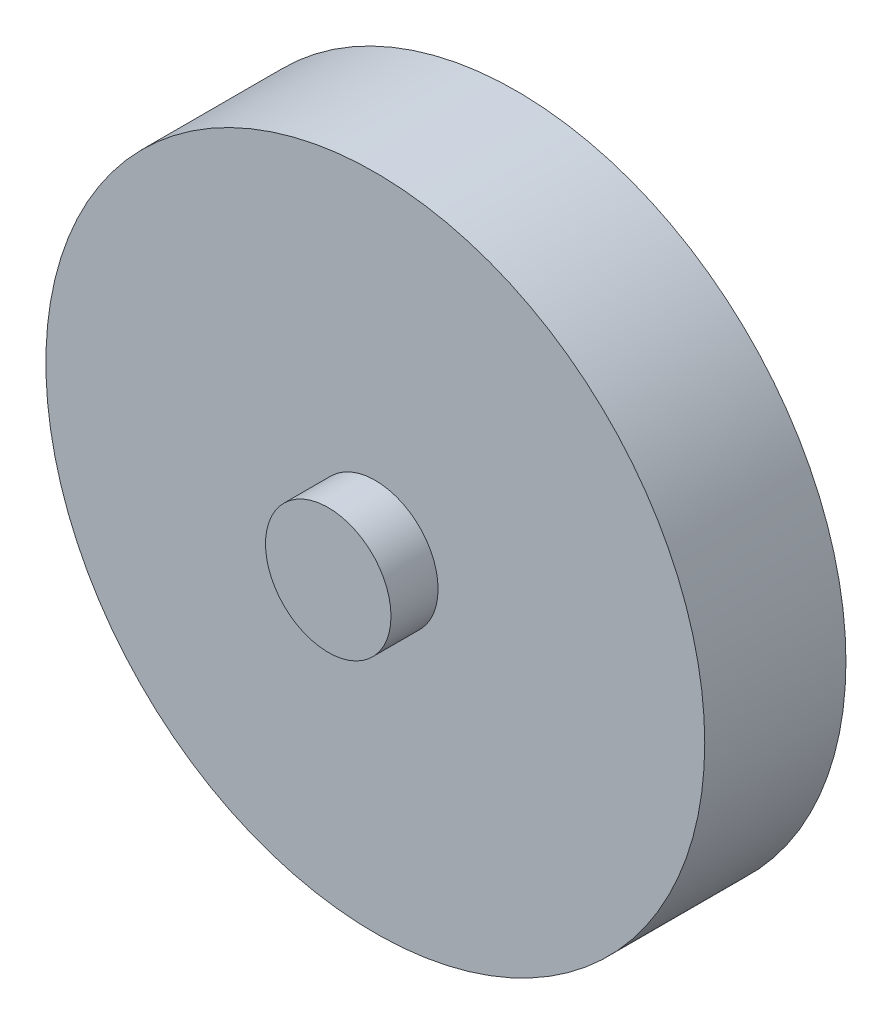
ISO-10303-21;
HEADER;
FILE_DESCRIPTION(('STEP AP214'),'2;1');
FILE_NAME('part.step','',(''),(''),'','','');
FILE_SCHEMA(('AUTOMOTIVE_DESIGN { 1 0 10303 214 1 1 1 1 }'));
ENDSEC;
DATA;
#1=APPLICATION_CONTEXT('core data for automotive mechanical design processes');
#2=APPLICATION_PROTOCOL_DEFINITION('international standard','automotive_design',2000,#1);
#3=PRODUCT_CONTEXT('',#1,'mechanical');
#4=PRODUCT('Part','Part','',(#3));
#5=PRODUCT_RELATED_PRODUCT_CATEGORY('part','',(#4));
#6=PRODUCT_DEFINITION_FORMATION('','',#4);
#7=PRODUCT_DEFINITION_CONTEXT('part definition',#1,'design');
#8=PRODUCT_DEFINITION('design','',#6,#7);
#9=PRODUCT_DEFINITION_SHAPE('','',#8);
#10=(LENGTH_UNIT() NAMED_UNIT(*) SI_UNIT(.MILLI.,.METRE.));
#11=(NAMED_UNIT(*) PLANE_ANGLE_UNIT() SI_UNIT($,.RADIAN.));
#12=(NAMED_UNIT(*) SI_UNIT($,.STERADIAN.) SOLID_ANGLE_UNIT());
#13=UNCERTAINTY_MEASURE_WITH_UNIT(LENGTH_MEASURE(1.E-05),#10,'distance_accuracy_value','');
#14=(GEOMETRIC_REPRESENTATION_CONTEXT(3) GLOBAL_UNCERTAINTY_ASSIGNED_CONTEXT((#13)) GLOBAL_UNIT_ASSIGNED_CONTEXT((#10,
#11,#12)) REPRESENTATION_CONTEXT('',''));
#15=CARTESIAN_POINT('',(0.,0.,0.));
#16=DIRECTION('',(0.,0.,1.));
#17=DIRECTION('',(1.,0.,0.));
#18=AXIS2_PLACEMENT_3D('',#15,#16,#17);
#19=CARTESIAN_POINT('',(0.,0.,24.));
#20=DIRECTION('',(0.,0.,-1.));
#21=DIRECTION('',(-1.,0.,0.));
#22=AXIS2_PLACEMENT_3D('',#19,#20,#21);
#23=CYLINDRICAL_SURFACE('',#22,8.);
#24=CARTESIAN_POINT('',(0.,0.,18.));
#25=DIRECTION('',(0.,0.,1.));
#26=DIRECTION('',(1.,0.,0.));
#27=AXIS2_PLACEMENT_3D('',#24,#25,#26);
#28=CIRCLE('',#27,8.);
#29=CARTESIAN_POINT('',(8.,0.,18.));
#30=VERTEX_POINT('',#29);
#31=EDGE_CURVE('E42',#30,#30,#28,.T.);
#32=ORIENTED_EDGE('',*,*,#31,.T.);
#33=EDGE_LOOP('',(#32));
#34=FACE_BOUND('',#33,.T.);
#35=CARTESIAN_POINT('',(0.,0.,24.));
#36=DIRECTION('',(0.,0.,1.));
#37=DIRECTION('',(1.,0.,0.));
#38=AXIS2_PLACEMENT_3D('',#35,#36,#37);
#39=CIRCLE('',#38,8.);
#40=CARTESIAN_POINT('',(8.,0.,24.));
#41=VERTEX_POINT('',#40);
#42=EDGE_CURVE('E10',#41,#41,#39,.T.);
#43=ORIENTED_EDGE('',*,*,#42,.F.);
#44=EDGE_LOOP('',(#43));
#45=FACE_BOUND('',#44,.T.);
#46=ADVANCED_FACE('F39',(#34,#45),#23,.T.);
#47=CARTESIAN_POINT('',(0.,0.,24.));
#48=DIRECTION('',(0.,0.,1.));
#49=DIRECTION('',(1.,0.,0.));
#50=AXIS2_PLACEMENT_3D('',#47,#48,#49);
#51=PLANE('',#50);
#52=ORIENTED_EDGE('',*,*,#42,.T.);
#53=EDGE_LOOP('',(#52));
#54=FACE_BOUND('',#53,.T.);
#55=ADVANCED_FACE('F62',(#54),#51,.T.);
#56=CARTESIAN_POINT('',(0.,0.,18.));
#57=DIRECTION('',(0.,0.,-1.));
#58=DIRECTION('',(-1.,0.,0.));
#59=AXIS2_PLACEMENT_3D('',#56,#57,#58);
#60=CYLINDRICAL_SURFACE('',#59,42.);
#61=CARTESIAN_POINT('',(0.,0.,18.));
#62=DIRECTION('',(0.,0.,1.));
#63=DIRECTION('',(1.,0.,0.));
#64=AXIS2_PLACEMENT_3D('',#61,#62,#63);
#65=CIRCLE('',#64,42.);
#66=CARTESIAN_POINT('',(42.,0.,18.));
#67=VERTEX_POINT('',#66);
#68=EDGE_CURVE('E49',#67,#67,#65,.T.);
#69=ORIENTED_EDGE('',*,*,#68,.F.);
#70=EDGE_LOOP('',(#69));
#71=FACE_BOUND('',#70,.T.);
#72=CARTESIAN_POINT('',(0.,0.,0.));
#73=DIRECTION('',(0.,0.,1.));
#74=DIRECTION('',(1.,0.,0.));
#75=AXIS2_PLACEMENT_3D('',#72,#73,#74);
#76=CIRCLE('',#75,42.);
#77=CARTESIAN_POINT('',(42.,0.,0.));
#78=VERTEX_POINT('',#77);
#79=EDGE_CURVE('E51',#78,#78,#76,.T.);
#80=ORIENTED_EDGE('',*,*,#79,.T.);
#81=EDGE_LOOP('',(#80));
#82=FACE_BOUND('',#81,.T.);
#83=ADVANCED_FACE('F59',(#71,#82),#60,.T.);
#84=CARTESIAN_POINT('',(0.,0.,18.));
#85=DIRECTION('',(0.,0.,1.));
#86=DIRECTION('',(1.,0.,0.));
#87=AXIS2_PLACEMENT_3D('',#84,#85,#86);
#88=PLANE('',#87);
#89=ORIENTED_EDGE('',*,*,#31,.F.);
#90=EDGE_LOOP('',(#89));
#91=FACE_BOUND('',#90,.T.);
#92=ORIENTED_EDGE('',*,*,#68,.T.);
#93=EDGE_LOOP('',(#92));
#94=FACE_BOUND('',#93,.T.);
#95=ADVANCED_FACE('F57',(#91,#94),#88,.T.);
#96=CARTESIAN_POINT('',(0.,0.,0.));
#97=DIRECTION('',(0.,0.,1.));
#98=DIRECTION('',(1.,0.,0.));
#99=AXIS2_PLACEMENT_3D('',#96,#97,#98);
#100=PLANE('',#99);
#101=ORIENTED_EDGE('',*,*,#79,.F.);
#102=EDGE_LOOP('',(#101));
#103=FACE_BOUND('',#102,.T.);
#104=ADVANCED_FACE('F66',(#103),#100,.F.);
#105=CLOSED_SHELL('',(#46,#55,#83,#95,#104));
#106=MANIFOLD_SOLID_BREP('B2',#105);
#107=ADVANCED_BREP_SHAPE_REPRESENTATION('',(#18,#106),#14);
#108=SHAPE_DEFINITION_REPRESENTATION(#9,#107);
ENDSEC;
END-ISO-10303-21;
